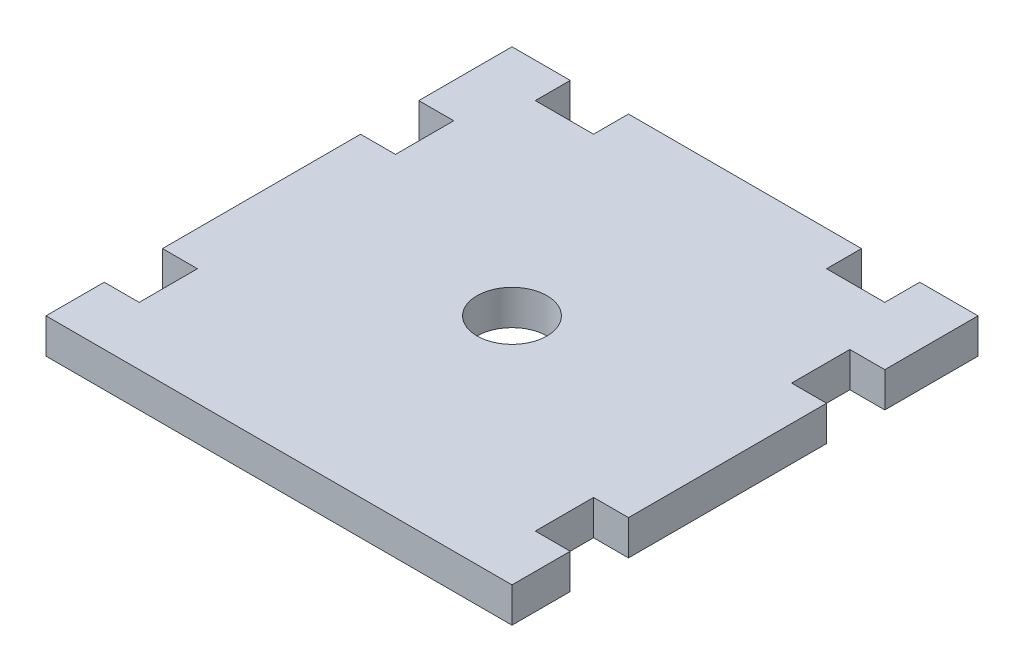
ISO-10303-21;
HEADER;
FILE_DESCRIPTION(('STEP AP214'),'2;1');
FILE_NAME('part.step','',(''),(''),'','','');
FILE_SCHEMA(('AUTOMOTIVE_DESIGN { 1 0 10303 214 1 1 1 1 }'));
ENDSEC;
DATA;
#1=APPLICATION_CONTEXT('core data for automotive mechanical design processes');
#2=APPLICATION_PROTOCOL_DEFINITION('international standard','automotive_design',2000,#1);
#3=PRODUCT_CONTEXT('',#1,'mechanical');
#4=PRODUCT('Part','Part','',(#3));
#5=PRODUCT_RELATED_PRODUCT_CATEGORY('part','',(#4));
#6=PRODUCT_DEFINITION_FORMATION('','',#4);
#7=PRODUCT_DEFINITION_CONTEXT('part definition',#1,'design');
#8=PRODUCT_DEFINITION('design','',#6,#7);
#9=PRODUCT_DEFINITION_SHAPE('','',#8);
#10=(LENGTH_UNIT() NAMED_UNIT(*) SI_UNIT(.MILLI.,.METRE.));
#11=(NAMED_UNIT(*) PLANE_ANGLE_UNIT() SI_UNIT($,.RADIAN.));
#12=(NAMED_UNIT(*) SI_UNIT($,.STERADIAN.) SOLID_ANGLE_UNIT());
#13=UNCERTAINTY_MEASURE_WITH_UNIT(LENGTH_MEASURE(1.E-05),#10,'distance_accuracy_value','');
#14=(GEOMETRIC_REPRESENTATION_CONTEXT(3) GLOBAL_UNCERTAINTY_ASSIGNED_CONTEXT((#13)) GLOBAL_UNIT_ASSIGNED_CONTEXT((#10,
#11,#12)) REPRESENTATION_CONTEXT('',''));
#15=CARTESIAN_POINT('',(0.,0.,0.));
#16=DIRECTION('',(0.,0.,1.));
#17=DIRECTION('',(1.,0.,0.));
#18=AXIS2_PLACEMENT_3D('',#15,#16,#17);
#19=CARTESIAN_POINT('',(20.,3.,20.));
#20=DIRECTION('',(-1.,0.,0.));
#21=DIRECTION('',(0.,0.,1.));
#22=AXIS2_PLACEMENT_3D('',#19,#20,#21);
#23=PLANE('',#22);
#24=DIRECTION('',(0.,0.,-1.));
#25=VECTOR('',#24,1.);
#26=CARTESIAN_POINT('',(20.,0.,20.));
#27=LINE('',#26,#25);
#28=CARTESIAN_POINT('',(20.,0.,10.));
#29=VERTEX_POINT('',#28);
#30=CARTESIAN_POINT('',(20.,0.,-7.));
#31=VERTEX_POINT('',#30);
#32=EDGE_CURVE('E422',#29,#31,#27,.T.);
#33=ORIENTED_EDGE('',*,*,#32,.T.);
#34=DIRECTION('',(0.,-1.,0.));
#35=VECTOR('',#34,1.);
#36=CARTESIAN_POINT('',(20.,3.,-7.));
#37=LINE('',#36,#35);
#38=CARTESIAN_POINT('',(20.,3.,-7.));
#39=VERTEX_POINT('',#38);
#40=EDGE_CURVE('E266',#39,#31,#37,.T.);
#41=ORIENTED_EDGE('',*,*,#40,.F.);
#42=DIRECTION('',(0.,0.,-1.));
#43=VECTOR('',#42,1.);
#44=CARTESIAN_POINT('',(20.,3.,20.));
#45=LINE('',#44,#43);
#46=CARTESIAN_POINT('',(20.,3.,10.));
#47=VERTEX_POINT('',#46);
#48=EDGE_CURVE('E404',#47,#39,#45,.T.);
#49=ORIENTED_EDGE('',*,*,#48,.F.);
#50=DIRECTION('',(0.,-1.,0.));
#51=VECTOR('',#50,1.);
#52=CARTESIAN_POINT('',(20.,3.,10.));
#53=LINE('',#52,#51);
#54=EDGE_CURVE('E337',#47,#29,#53,.T.);
#55=ORIENTED_EDGE('',*,*,#54,.T.);
#56=EDGE_LOOP('',(#33,#41,#49,#55));
#57=FACE_BOUND('',#56,.T.);
#58=ADVANCED_FACE('F44',(#57),#23,.F.);
#59=CARTESIAN_POINT('',(20.,0.,20.));
#60=VERTEX_POINT('',#59);
#61=CARTESIAN_POINT('',(20.,0.,15.));
#62=VERTEX_POINT('',#61);
#63=EDGE_CURVE('E418',#60,#62,#27,.T.);
#64=ORIENTED_EDGE('',*,*,#63,.T.);
#65=DIRECTION('',(0.,-1.,0.));
#66=VECTOR('',#65,1.);
#67=CARTESIAN_POINT('',(20.,3.,15.));
#68=LINE('',#67,#66);
#69=CARTESIAN_POINT('',(20.,3.,15.));
#70=VERTEX_POINT('',#69);
#71=EDGE_CURVE('E335',#70,#62,#68,.T.);
#72=ORIENTED_EDGE('',*,*,#71,.F.);
#73=CARTESIAN_POINT('',(20.,3.,20.));
#74=VERTEX_POINT('',#73);
#75=EDGE_CURVE('E400',#74,#70,#45,.T.);
#76=ORIENTED_EDGE('',*,*,#75,.F.);
#77=DIRECTION('',(0.,-1.,0.));
#78=VECTOR('',#77,1.);
#79=CARTESIAN_POINT('',(20.,3.,20.));
#80=LINE('',#79,#78);
#81=EDGE_CURVE('E417',#74,#60,#80,.T.);
#82=ORIENTED_EDGE('',*,*,#81,.T.);
#83=EDGE_LOOP('',(#64,#72,#76,#82));
#84=FACE_BOUND('',#83,.T.);
#85=ADVANCED_FACE('F485',(#84),#23,.F.);
#86=CARTESIAN_POINT('',(-20.,3.,20.));
#87=DIRECTION('',(1.,0.,0.));
#88=DIRECTION('',(0.,0.,-1.));
#89=AXIS2_PLACEMENT_3D('',#86,#87,#88);
#90=PLANE('',#89);
#91=DIRECTION('',(0.,0.,1.));
#92=VECTOR('',#91,1.);
#93=CARTESIAN_POINT('',(-20.,0.,20.));
#94=LINE('',#93,#92);
#95=CARTESIAN_POINT('',(-20.,0.,-7.));
#96=VERTEX_POINT('',#95);
#97=CARTESIAN_POINT('',(-20.,0.,10.));
#98=VERTEX_POINT('',#97);
#99=EDGE_CURVE('E432',#96,#98,#94,.T.);
#100=ORIENTED_EDGE('',*,*,#99,.T.);
#101=DIRECTION('',(0.,-1.,0.));
#102=VECTOR('',#101,1.);
#103=CARTESIAN_POINT('',(-20.,3.,10.));
#104=LINE('',#103,#102);
#105=CARTESIAN_POINT('',(-20.,3.,10.));
#106=VERTEX_POINT('',#105);
#107=EDGE_CURVE('E310',#106,#98,#104,.T.);
#108=ORIENTED_EDGE('',*,*,#107,.F.);
#109=DIRECTION('',(0.,0.,1.));
#110=VECTOR('',#109,1.);
#111=CARTESIAN_POINT('',(-20.,3.,20.));
#112=LINE('',#111,#110);
#113=CARTESIAN_POINT('',(-20.,3.,-7.));
#114=VERTEX_POINT('',#113);
#115=EDGE_CURVE('E415',#114,#106,#112,.T.);
#116=ORIENTED_EDGE('',*,*,#115,.F.);
#117=DIRECTION('',(0.,-1.,0.));
#118=VECTOR('',#117,1.);
#119=CARTESIAN_POINT('',(-20.,3.,-7.));
#120=LINE('',#119,#118);
#121=EDGE_CURVE('E289',#114,#96,#120,.T.);
#122=ORIENTED_EDGE('',*,*,#121,.T.);
#123=EDGE_LOOP('',(#100,#108,#116,#122));
#124=FACE_BOUND('',#123,.T.);
#125=ADVANCED_FACE('F495',(#124),#90,.F.);
#126=CARTESIAN_POINT('',(-20.,0.,-20.));
#127=VERTEX_POINT('',#126);
#128=CARTESIAN_POINT('',(-20.,0.,-12.));
#129=VERTEX_POINT('',#128);
#130=EDGE_CURVE('E428',#127,#129,#94,.T.);
#131=ORIENTED_EDGE('',*,*,#130,.T.);
#132=DIRECTION('',(0.,-1.,0.));
#133=VECTOR('',#132,1.);
#134=CARTESIAN_POINT('',(-20.,3.,-12.));
#135=LINE('',#134,#133);
#136=CARTESIAN_POINT('',(-20.,3.,-12.));
#137=VERTEX_POINT('',#136);
#138=EDGE_CURVE('E287',#137,#129,#135,.T.);
#139=ORIENTED_EDGE('',*,*,#138,.F.);
#140=CARTESIAN_POINT('',(-20.,3.,-20.));
#141=VERTEX_POINT('',#140);
#142=EDGE_CURVE('E411',#141,#137,#112,.T.);
#143=ORIENTED_EDGE('',*,*,#142,.F.);
#144=DIRECTION('',(0.,-1.,0.));
#145=VECTOR('',#144,1.);
#146=CARTESIAN_POINT('',(-20.,3.,-20.));
#147=LINE('',#146,#145);
#148=EDGE_CURVE('E52',#141,#127,#147,.T.);
#149=ORIENTED_EDGE('',*,*,#148,.T.);
#150=EDGE_LOOP('',(#131,#139,#143,#149));
#151=FACE_BOUND('',#150,.T.);
#152=ADVANCED_FACE('F443',(#151),#90,.F.);
#153=CARTESIAN_POINT('',(-20.,3.,-20.));
#154=DIRECTION('',(0.,0.,1.));
#155=DIRECTION('',(1.,0.,0.));
#156=AXIS2_PLACEMENT_3D('',#153,#154,#155);
#157=PLANE('',#156);
#158=DIRECTION('',(-1.,0.,0.));
#159=VECTOR('',#158,1.);
#160=CARTESIAN_POINT('',(-20.,0.,-20.));
#161=LINE('',#160,#159);
#162=CARTESIAN_POINT('',(20.,0.,-20.));
#163=VERTEX_POINT('',#162);
#164=CARTESIAN_POINT('',(15.,0.,-20.));
#165=VERTEX_POINT('',#164);
#166=EDGE_CURVE('E423',#163,#165,#161,.T.);
#167=ORIENTED_EDGE('',*,*,#166,.T.);
#168=DIRECTION('',(0.,-1.,0.));
#169=VECTOR('',#168,1.);
#170=CARTESIAN_POINT('',(15.,10.,-20.));
#171=LINE('',#170,#169);
#172=CARTESIAN_POINT('',(15.,3.,-20.));
#173=VERTEX_POINT('',#172);
#174=EDGE_CURVE('E351',#173,#165,#171,.T.);
#175=ORIENTED_EDGE('',*,*,#174,.F.);
#176=DIRECTION('',(-1.,0.,0.));
#177=VECTOR('',#176,1.);
#178=CARTESIAN_POINT('',(-20.,3.,-20.));
#179=LINE('',#178,#177);
#180=CARTESIAN_POINT('',(20.,3.,-20.));
#181=VERTEX_POINT('',#180);
#182=EDGE_CURVE('E406',#181,#173,#179,.T.);
#183=ORIENTED_EDGE('',*,*,#182,.F.);
#184=DIRECTION('',(0.,-1.,0.));
#185=VECTOR('',#184,1.);
#186=CARTESIAN_POINT('',(20.,3.,-20.));
#187=LINE('',#186,#185);
#188=EDGE_CURVE('E13',#181,#163,#187,.T.);
#189=ORIENTED_EDGE('',*,*,#188,.T.);
#190=EDGE_LOOP('',(#167,#175,#183,#189));
#191=FACE_BOUND('',#190,.T.);
#192=ADVANCED_FACE('F478',(#191),#157,.F.);
#193=CARTESIAN_POINT('',(-15.,3.,-20.));
#194=VERTEX_POINT('',#193);
#195=EDGE_CURVE('E403',#194,#141,#179,.T.);
#196=ORIENTED_EDGE('',*,*,#195,.F.);
#197=DIRECTION('',(0.,-1.,0.));
#198=VECTOR('',#197,1.);
#199=CARTESIAN_POINT('',(-15.,10.,-20.));
#200=LINE('',#199,#198);
#201=CARTESIAN_POINT('',(-15.,0.,-20.));
#202=VERTEX_POINT('',#201);
#203=EDGE_CURVE('E368',#194,#202,#200,.T.);
#204=ORIENTED_EDGE('',*,*,#203,.T.);
#205=EDGE_CURVE('E421',#202,#127,#161,.T.);
#206=ORIENTED_EDGE('',*,*,#205,.T.);
#207=ORIENTED_EDGE('',*,*,#148,.F.);
#208=EDGE_LOOP('',(#196,#204,#206,#207));
#209=FACE_BOUND('',#208,.T.);
#210=ADVANCED_FACE('F476',(#209),#157,.F.);
#211=CARTESIAN_POINT('',(20.,3.,-12.));
#212=VERTEX_POINT('',#211);
#213=EDGE_CURVE('E405',#212,#181,#45,.T.);
#214=ORIENTED_EDGE('',*,*,#213,.F.);
#215=DIRECTION('',(0.,-1.,0.));
#216=VECTOR('',#215,1.);
#217=CARTESIAN_POINT('',(20.,3.,-12.));
#218=LINE('',#217,#216);
#219=CARTESIAN_POINT('',(20.,0.,-12.));
#220=VERTEX_POINT('',#219);
#221=EDGE_CURVE('E239',#212,#220,#218,.T.);
#222=ORIENTED_EDGE('',*,*,#221,.T.);
#223=EDGE_CURVE('E397',#220,#163,#27,.T.);
#224=ORIENTED_EDGE('',*,*,#223,.T.);
#225=ORIENTED_EDGE('',*,*,#188,.F.);
#226=EDGE_LOOP('',(#214,#222,#224,#225));
#227=FACE_BOUND('',#226,.T.);
#228=ADVANCED_FACE('F46',(#227),#23,.F.);
#229=CARTESIAN_POINT('',(10.,3.,-20.));
#230=VERTEX_POINT('',#229);
#231=CARTESIAN_POINT('',(-10.,3.,-20.));
#232=VERTEX_POINT('',#231);
#233=EDGE_CURVE('E410',#230,#232,#179,.T.);
#234=ORIENTED_EDGE('',*,*,#233,.F.);
#235=DIRECTION('',(0.,-1.,0.));
#236=VECTOR('',#235,1.);
#237=CARTESIAN_POINT('',(10.,10.,-20.));
#238=LINE('',#237,#236);
#239=CARTESIAN_POINT('',(10.,0.,-20.));
#240=VERTEX_POINT('',#239);
#241=EDGE_CURVE('E354',#230,#240,#238,.T.);
#242=ORIENTED_EDGE('',*,*,#241,.T.);
#243=CARTESIAN_POINT('',(-10.,0.,-20.));
#244=VERTEX_POINT('',#243);
#245=EDGE_CURVE('E427',#240,#244,#161,.T.);
#246=ORIENTED_EDGE('',*,*,#245,.T.);
#247=DIRECTION('',(0.,-1.,0.));
#248=VECTOR('',#247,1.);
#249=CARTESIAN_POINT('',(-10.,10.,-20.));
#250=LINE('',#249,#248);
#251=EDGE_CURVE('E372',#232,#244,#250,.T.);
#252=ORIENTED_EDGE('',*,*,#251,.F.);
#253=EDGE_LOOP('',(#234,#242,#246,#252));
#254=FACE_BOUND('',#253,.T.);
#255=ADVANCED_FACE('F462',(#254),#157,.F.);
#256=CARTESIAN_POINT('',(-20.,3.,15.));
#257=VERTEX_POINT('',#256);
#258=CARTESIAN_POINT('',(-20.,3.,20.));
#259=VERTEX_POINT('',#258);
#260=EDGE_CURVE('E409',#257,#259,#112,.T.);
#261=ORIENTED_EDGE('',*,*,#260,.F.);
#262=DIRECTION('',(0.,-1.,0.));
#263=VECTOR('',#262,1.);
#264=CARTESIAN_POINT('',(-20.,3.,15.));
#265=LINE('',#264,#263);
#266=CARTESIAN_POINT('',(-20.,0.,15.));
#267=VERTEX_POINT('',#266);
#268=EDGE_CURVE('E312',#257,#267,#265,.T.);
#269=ORIENTED_EDGE('',*,*,#268,.T.);
#270=CARTESIAN_POINT('',(-20.,0.,20.));
#271=VERTEX_POINT('',#270);
#272=EDGE_CURVE('E426',#267,#271,#94,.T.);
#273=ORIENTED_EDGE('',*,*,#272,.T.);
#274=DIRECTION('',(0.,-1.,0.));
#275=VECTOR('',#274,1.);
#276=CARTESIAN_POINT('',(-20.,3.,20.));
#277=LINE('',#276,#275);
#278=EDGE_CURVE('E436',#259,#271,#277,.T.);
#279=ORIENTED_EDGE('',*,*,#278,.F.);
#280=EDGE_LOOP('',(#261,#269,#273,#279));
#281=FACE_BOUND('',#280,.T.);
#282=ADVANCED_FACE('F488',(#281),#90,.F.);
#283=CARTESIAN_POINT('',(-20.,3.,20.));
#284=DIRECTION('',(0.,0.,-1.));
#285=DIRECTION('',(-1.,0.,0.));
#286=AXIS2_PLACEMENT_3D('',#283,#284,#285);
#287=PLANE('',#286);
#288=DIRECTION('',(1.,0.,0.));
#289=VECTOR('',#288,1.);
#290=CARTESIAN_POINT('',(-20.,0.,20.));
#291=LINE('',#290,#289);
#292=EDGE_CURVE('E431',#271,#60,#291,.T.);
#293=ORIENTED_EDGE('',*,*,#292,.T.);
#294=ORIENTED_EDGE('',*,*,#81,.F.);
#295=DIRECTION('',(1.,0.,0.));
#296=VECTOR('',#295,1.);
#297=CARTESIAN_POINT('',(-20.,3.,20.));
#298=LINE('',#297,#296);
#299=EDGE_CURVE('E414',#259,#74,#298,.T.);
#300=ORIENTED_EDGE('',*,*,#299,.F.);
#301=ORIENTED_EDGE('',*,*,#278,.T.);
#302=EDGE_LOOP('',(#293,#294,#300,#301));
#303=FACE_BOUND('',#302,.T.);
#304=ADVANCED_FACE('F528',(#303),#287,.F.);
#305=CARTESIAN_POINT('',(0.,3.,0.));
#306=DIRECTION('',(0.,-1.,0.));
#307=DIRECTION('',(0.,0.,-1.));
#308=AXIS2_PLACEMENT_3D('',#305,#306,#307);
#309=PLANE('',#308);
#310=ORIENTED_EDGE('',*,*,#115,.T.);
#311=DIRECTION('',(1.,0.,0.));
#312=VECTOR('',#311,1.);
#313=CARTESIAN_POINT('',(-17.,3.,10.));
#314=LINE('',#313,#312);
#315=CARTESIAN_POINT('',(-17.,3.,10.));
#316=VERTEX_POINT('',#315);
#317=EDGE_CURVE('E300',#106,#316,#314,.T.);
#318=ORIENTED_EDGE('',*,*,#317,.T.);
#319=DIRECTION('',(0.,0.,1.));
#320=VECTOR('',#319,1.);
#321=CARTESIAN_POINT('',(-17.,3.,15.));
#322=LINE('',#321,#320);
#323=CARTESIAN_POINT('',(-17.,3.,15.));
#324=VERTEX_POINT('',#323);
#325=EDGE_CURVE('E293',#316,#324,#322,.T.);
#326=ORIENTED_EDGE('',*,*,#325,.T.);
#327=DIRECTION('',(-1.,0.,0.));
#328=VECTOR('',#327,1.);
#329=CARTESIAN_POINT('',(-17.,3.,15.));
#330=LINE('',#329,#328);
#331=EDGE_CURVE('E296',#324,#257,#330,.T.);
#332=ORIENTED_EDGE('',*,*,#331,.T.);
#333=ORIENTED_EDGE('',*,*,#260,.T.);
#334=ORIENTED_EDGE('',*,*,#299,.T.);
#335=ORIENTED_EDGE('',*,*,#75,.T.);
#336=DIRECTION('',(-1.,0.,0.));
#337=VECTOR('',#336,1.);
#338=CARTESIAN_POINT('',(17.,3.,15.));
#339=LINE('',#338,#337);
#340=CARTESIAN_POINT('',(17.,3.,15.));
#341=VERTEX_POINT('',#340);
#342=EDGE_CURVE('E323',#70,#341,#339,.T.);
#343=ORIENTED_EDGE('',*,*,#342,.T.);
#344=DIRECTION('',(0.,0.,-1.));
#345=VECTOR('',#344,1.);
#346=CARTESIAN_POINT('',(17.,3.,15.));
#347=LINE('',#346,#345);
#348=CARTESIAN_POINT('',(17.,3.,10.));
#349=VERTEX_POINT('',#348);
#350=EDGE_CURVE('E316',#341,#349,#347,.T.);
#351=ORIENTED_EDGE('',*,*,#350,.T.);
#352=DIRECTION('',(1.,0.,0.));
#353=VECTOR('',#352,1.);
#354=CARTESIAN_POINT('',(17.,3.,10.));
#355=LINE('',#354,#353);
#356=EDGE_CURVE('E319',#349,#47,#355,.T.);
#357=ORIENTED_EDGE('',*,*,#356,.T.);
#358=ORIENTED_EDGE('',*,*,#48,.T.);
#359=DIRECTION('',(-1.,0.,0.));
#360=VECTOR('',#359,1.);
#361=CARTESIAN_POINT('',(17.,3.,-7.));
#362=LINE('',#361,#360);
#363=CARTESIAN_POINT('',(17.,3.,-7.));
#364=VERTEX_POINT('',#363);
#365=EDGE_CURVE('E240',#39,#364,#362,.T.);
#366=ORIENTED_EDGE('',*,*,#365,.T.);
#367=DIRECTION('',(0.,0.,-1.));
#368=VECTOR('',#367,1.);
#369=CARTESIAN_POINT('',(17.,3.,-7.));
#370=LINE('',#369,#368);
#371=CARTESIAN_POINT('',(17.,3.,-12.));
#372=VERTEX_POINT('',#371);
#373=EDGE_CURVE('E233',#364,#372,#370,.T.);
#374=ORIENTED_EDGE('',*,*,#373,.T.);
#375=DIRECTION('',(1.,0.,0.));
#376=VECTOR('',#375,1.);
#377=CARTESIAN_POINT('',(17.,3.,-12.));
#378=LINE('',#377,#376);
#379=EDGE_CURVE('E243',#372,#212,#378,.T.);
#380=ORIENTED_EDGE('',*,*,#379,.T.);
#381=ORIENTED_EDGE('',*,*,#213,.T.);
#382=ORIENTED_EDGE('',*,*,#182,.T.);
#383=DIRECTION('',(0.,0.,1.));
#384=VECTOR('',#383,1.);
#385=CARTESIAN_POINT('',(15.,3.,0.));
#386=LINE('',#385,#384);
#387=CARTESIAN_POINT('',(15.,3.,-17.));
#388=VERTEX_POINT('',#387);
#389=EDGE_CURVE('E390',#173,#388,#386,.T.);
#390=ORIENTED_EDGE('',*,*,#389,.T.);
#391=DIRECTION('',(-1.,0.,0.));
#392=VECTOR('',#391,1.);
#393=CARTESIAN_POINT('',(0.,3.,-17.));
#394=LINE('',#393,#392);
#395=CARTESIAN_POINT('',(10.,3.,-17.));
#396=VERTEX_POINT('',#395);
#397=EDGE_CURVE('E384',#388,#396,#394,.T.);
#398=ORIENTED_EDGE('',*,*,#397,.T.);
#399=DIRECTION('',(0.,0.,-1.));
#400=VECTOR('',#399,1.);
#401=CARTESIAN_POINT('',(10.,3.,0.));
#402=LINE('',#401,#400);
#403=EDGE_CURVE('E387',#396,#230,#402,.T.);
#404=ORIENTED_EDGE('',*,*,#403,.T.);
#405=ORIENTED_EDGE('',*,*,#233,.T.);
#406=DIRECTION('',(0.,0.,1.));
#407=VECTOR('',#406,1.);
#408=CARTESIAN_POINT('',(-10.,3.,0.));
#409=LINE('',#408,#407);
#410=CARTESIAN_POINT('',(-10.,3.,-17.));
#411=VERTEX_POINT('',#410);
#412=EDGE_CURVE('E353',#232,#411,#409,.T.);
#413=ORIENTED_EDGE('',*,*,#412,.T.);
#414=DIRECTION('',(-1.,0.,0.));
#415=VECTOR('',#414,1.);
#416=CARTESIAN_POINT('',(0.,3.,-17.));
#417=LINE('',#416,#415);
#418=CARTESIAN_POINT('',(-15.,3.,-17.));
#419=VERTEX_POINT('',#418);
#420=EDGE_CURVE('E378',#411,#419,#417,.T.);
#421=ORIENTED_EDGE('',*,*,#420,.T.);
#422=DIRECTION('',(0.,0.,-1.));
#423=VECTOR('',#422,1.);
#424=CARTESIAN_POINT('',(-15.,3.,0.));
#425=LINE('',#424,#423);
#426=EDGE_CURVE('E381',#419,#194,#425,.T.);
#427=ORIENTED_EDGE('',*,*,#426,.T.);
#428=ORIENTED_EDGE('',*,*,#195,.T.);
#429=ORIENTED_EDGE('',*,*,#142,.T.);
#430=DIRECTION('',(1.,0.,0.));
#431=VECTOR('',#430,1.);
#432=CARTESIAN_POINT('',(-17.,3.,-12.));
#433=LINE('',#432,#431);
#434=CARTESIAN_POINT('',(-17.,3.,-12.));
#435=VERTEX_POINT('',#434);
#436=EDGE_CURVE('E276',#137,#435,#433,.T.);
#437=ORIENTED_EDGE('',*,*,#436,.T.);
#438=DIRECTION('',(0.,0.,1.));
#439=VECTOR('',#438,1.);
#440=CARTESIAN_POINT('',(-17.,3.,-7.));
#441=LINE('',#440,#439);
#442=CARTESIAN_POINT('',(-17.,3.,-7.));
#443=VERTEX_POINT('',#442);
#444=EDGE_CURVE('E269',#435,#443,#441,.T.);
#445=ORIENTED_EDGE('',*,*,#444,.T.);
#446=DIRECTION('',(-1.,0.,0.));
#447=VECTOR('',#446,1.);
#448=CARTESIAN_POINT('',(-17.,3.,-7.));
#449=LINE('',#448,#447);
#450=EDGE_CURVE('E272',#443,#114,#449,.T.);
#451=ORIENTED_EDGE('',*,*,#450,.T.);
#452=EDGE_LOOP('',(#310,#318,#326,#332,#333,#334,#335,#343,#351,#357,#358,#366,#374,#380,#381,
#382,#390,#398,#404,#405,#413,#421,#427,#428,#429,#437,#445,#451));
#453=FACE_BOUND('',#452,.T.);
#454=CARTESIAN_POINT('',(0.,3.,0.));
#455=DIRECTION('',(0.,1.,0.));
#456=DIRECTION('',(0.,0.,1.));
#457=AXIS2_PLACEMENT_3D('',#454,#455,#456);
#458=CIRCLE('',#457,3.);
#459=CARTESIAN_POINT('',(0.,3.,3.));
#460=VERTEX_POINT('',#459);
#461=EDGE_CURVE('E393',#460,#460,#458,.T.);
#462=ORIENTED_EDGE('',*,*,#461,.F.);
#463=EDGE_LOOP('',(#462));
#464=FACE_BOUND('',#463,.T.);
#465=ADVANCED_FACE('F250',(#453,#464),#309,.F.);
#466=CARTESIAN_POINT('',(0.,0.,0.));
#467=DIRECTION('',(0.,-1.,0.));
#468=DIRECTION('',(0.,0.,-1.));
#469=AXIS2_PLACEMENT_3D('',#466,#467,#468);
#470=PLANE('',#469);
#471=DIRECTION('',(1.,0.,0.));
#472=VECTOR('',#471,1.);
#473=CARTESIAN_POINT('',(-17.,0.,10.));
#474=LINE('',#473,#472);
#475=CARTESIAN_POINT('',(-17.,0.,10.));
#476=VERTEX_POINT('',#475);
#477=EDGE_CURVE('E297',#98,#476,#474,.T.);
#478=ORIENTED_EDGE('',*,*,#477,.F.);
#479=ORIENTED_EDGE('',*,*,#99,.F.);
#480=DIRECTION('',(-1.,0.,0.));
#481=VECTOR('',#480,1.);
#482=CARTESIAN_POINT('',(-17.,0.,-7.));
#483=LINE('',#482,#481);
#484=CARTESIAN_POINT('',(-17.,0.,-7.));
#485=VERTEX_POINT('',#484);
#486=EDGE_CURVE('E281',#485,#96,#483,.T.);
#487=ORIENTED_EDGE('',*,*,#486,.F.);
#488=DIRECTION('',(0.,0.,1.));
#489=VECTOR('',#488,1.);
#490=CARTESIAN_POINT('',(-17.,0.,-7.));
#491=LINE('',#490,#489);
#492=CARTESIAN_POINT('',(-17.,0.,-12.));
#493=VERTEX_POINT('',#492);
#494=EDGE_CURVE('E67',#493,#485,#491,.T.);
#495=ORIENTED_EDGE('',*,*,#494,.F.);
#496=DIRECTION('',(1.,0.,0.));
#497=VECTOR('',#496,1.);
#498=CARTESIAN_POINT('',(-17.,0.,-12.));
#499=LINE('',#498,#497);
#500=EDGE_CURVE('E273',#129,#493,#499,.T.);
#501=ORIENTED_EDGE('',*,*,#500,.F.);
#502=ORIENTED_EDGE('',*,*,#130,.F.);
#503=ORIENTED_EDGE('',*,*,#205,.F.);
#504=DIRECTION('',(0.,0.,-1.));
#505=VECTOR('',#504,1.);
#506=CARTESIAN_POINT('',(-15.,0.,-20.));
#507=LINE('',#506,#505);
#508=CARTESIAN_POINT('',(-15.,0.,-17.));
#509=VERTEX_POINT('',#508);
#510=EDGE_CURVE('E334',#509,#202,#507,.T.);
#511=ORIENTED_EDGE('',*,*,#510,.F.);
#512=DIRECTION('',(-1.,0.,0.));
#513=VECTOR('',#512,1.);
#514=CARTESIAN_POINT('',(-15.,0.,-17.));
#515=LINE('',#514,#513);
#516=CARTESIAN_POINT('',(-10.,0.,-17.));
#517=VERTEX_POINT('',#516);
#518=EDGE_CURVE('E365',#517,#509,#515,.T.);
#519=ORIENTED_EDGE('',*,*,#518,.F.);
#520=DIRECTION('',(0.,0.,1.));
#521=VECTOR('',#520,1.);
#522=CARTESIAN_POINT('',(-10.,0.,-20.));
#523=LINE('',#522,#521);
#524=EDGE_CURVE('E362',#244,#517,#523,.T.);
#525=ORIENTED_EDGE('',*,*,#524,.F.);
#526=ORIENTED_EDGE('',*,*,#245,.F.);
#527=DIRECTION('',(0.,0.,-1.));
#528=VECTOR('',#527,1.);
#529=CARTESIAN_POINT('',(10.,0.,-20.));
#530=LINE('',#529,#528);
#531=CARTESIAN_POINT('',(10.,0.,-17.));
#532=VERTEX_POINT('',#531);
#533=EDGE_CURVE('E348',#532,#240,#530,.T.);
#534=ORIENTED_EDGE('',*,*,#533,.F.);
#535=DIRECTION('',(-1.,0.,0.));
#536=VECTOR('',#535,1.);
#537=CARTESIAN_POINT('',(15.,0.,-17.));
#538=LINE('',#537,#536);
#539=CARTESIAN_POINT('',(15.,0.,-17.));
#540=VERTEX_POINT('',#539);
#541=EDGE_CURVE('E344',#540,#532,#538,.T.);
#542=ORIENTED_EDGE('',*,*,#541,.F.);
#543=DIRECTION('',(0.,0.,1.));
#544=VECTOR('',#543,1.);
#545=CARTESIAN_POINT('',(15.,0.,-20.));
#546=LINE('',#545,#544);
#547=EDGE_CURVE('E342',#165,#540,#546,.T.);
#548=ORIENTED_EDGE('',*,*,#547,.F.);
#549=ORIENTED_EDGE('',*,*,#166,.F.);
#550=ORIENTED_EDGE('',*,*,#223,.F.);
#551=DIRECTION('',(1.,0.,0.));
#552=VECTOR('',#551,1.);
#553=CARTESIAN_POINT('',(17.,0.,-12.));
#554=LINE('',#553,#552);
#555=CARTESIAN_POINT('',(17.,0.,-12.));
#556=VERTEX_POINT('',#555);
#557=EDGE_CURVE('E256',#556,#220,#554,.T.);
#558=ORIENTED_EDGE('',*,*,#557,.F.);
#559=DIRECTION('',(0.,0.,-1.));
#560=VECTOR('',#559,1.);
#561=CARTESIAN_POINT('',(17.,0.,-7.));
#562=LINE('',#561,#560);
#563=CARTESIAN_POINT('',(17.,0.,-7.));
#564=VERTEX_POINT('',#563);
#565=EDGE_CURVE('E236',#564,#556,#562,.T.);
#566=ORIENTED_EDGE('',*,*,#565,.F.);
#567=DIRECTION('',(-1.,0.,0.));
#568=VECTOR('',#567,1.);
#569=CARTESIAN_POINT('',(17.,0.,-7.));
#570=LINE('',#569,#568);
#571=EDGE_CURVE('E253',#31,#564,#570,.T.);
#572=ORIENTED_EDGE('',*,*,#571,.F.);
#573=ORIENTED_EDGE('',*,*,#32,.F.);
#574=DIRECTION('',(1.,0.,0.));
#575=VECTOR('',#574,1.);
#576=CARTESIAN_POINT('',(17.,0.,10.));
#577=LINE('',#576,#575);
#578=CARTESIAN_POINT('',(17.,0.,10.));
#579=VERTEX_POINT('',#578);
#580=EDGE_CURVE('E328',#579,#29,#577,.T.);
#581=ORIENTED_EDGE('',*,*,#580,.F.);
#582=DIRECTION('',(0.,0.,-1.));
#583=VECTOR('',#582,1.);
#584=CARTESIAN_POINT('',(17.,0.,15.));
#585=LINE('',#584,#583);
#586=CARTESIAN_POINT('',(17.,0.,15.));
#587=VERTEX_POINT('',#586);
#588=EDGE_CURVE('E265',#587,#579,#585,.T.);
#589=ORIENTED_EDGE('',*,*,#588,.F.);
#590=DIRECTION('',(-1.,0.,0.));
#591=VECTOR('',#590,1.);
#592=CARTESIAN_POINT('',(17.,0.,15.));
#593=LINE('',#592,#591);
#594=EDGE_CURVE('E320',#62,#587,#593,.T.);
#595=ORIENTED_EDGE('',*,*,#594,.F.);
#596=ORIENTED_EDGE('',*,*,#63,.F.);
#597=ORIENTED_EDGE('',*,*,#292,.F.);
#598=ORIENTED_EDGE('',*,*,#272,.F.);
#599=DIRECTION('',(-1.,0.,0.));
#600=VECTOR('',#599,1.);
#601=CARTESIAN_POINT('',(-17.,0.,15.));
#602=LINE('',#601,#600);
#603=CARTESIAN_POINT('',(-17.,0.,15.));
#604=VERTEX_POINT('',#603);
#605=EDGE_CURVE('E305',#604,#267,#602,.T.);
#606=ORIENTED_EDGE('',*,*,#605,.F.);
#607=DIRECTION('',(0.,0.,1.));
#608=VECTOR('',#607,1.);
#609=CARTESIAN_POINT('',(-17.,0.,15.));
#610=LINE('',#609,#608);
#611=EDGE_CURVE('E59',#476,#604,#610,.T.);
#612=ORIENTED_EDGE('',*,*,#611,.F.);
#613=EDGE_LOOP('',(#478,#479,#487,#495,#501,#502,#503,#511,#519,#525,#526,#534,#542,#548,#549,
#550,#558,#566,#572,#573,#581,#589,#595,#596,#597,#598,#606,#612));
#614=FACE_BOUND('',#613,.T.);
#615=CARTESIAN_POINT('',(0.,0.,0.));
#616=DIRECTION('',(0.,1.,0.));
#617=DIRECTION('',(0.,0.,1.));
#618=AXIS2_PLACEMENT_3D('',#615,#616,#617);
#619=CIRCLE('',#618,3.);
#620=CARTESIAN_POINT('',(0.,0.,3.));
#621=VERTEX_POINT('',#620);
#622=EDGE_CURVE('E394',#621,#621,#619,.T.);
#623=ORIENTED_EDGE('',*,*,#622,.T.);
#624=EDGE_LOOP('',(#623));
#625=FACE_BOUND('',#624,.T.);
#626=ADVANCED_FACE('F451',(#614,#625),#470,.T.);
#627=CARTESIAN_POINT('',(0.,0.,0.));
#628=DIRECTION('',(0.,1.,0.));
#629=DIRECTION('',(0.,0.,1.));
#630=AXIS2_PLACEMENT_3D('',#627,#628,#629);
#631=CYLINDRICAL_SURFACE('',#630,3.);
#632=ORIENTED_EDGE('',*,*,#622,.F.);
#633=EDGE_LOOP('',(#632));
#634=FACE_BOUND('',#633,.T.);
#635=ORIENTED_EDGE('',*,*,#461,.T.);
#636=EDGE_LOOP('',(#635));
#637=FACE_BOUND('',#636,.T.);
#638=ADVANCED_FACE('F589',(#634,#637),#631,.F.);
#639=CARTESIAN_POINT('',(-15.,10.,-20.));
#640=DIRECTION('',(-1.,0.,0.));
#641=DIRECTION('',(0.,0.,1.));
#642=AXIS2_PLACEMENT_3D('',#639,#640,#641);
#643=PLANE('',#642);
#644=DIRECTION('',(0.,-1.,0.));
#645=VECTOR('',#644,1.);
#646=CARTESIAN_POINT('',(-15.,10.,-17.));
#647=LINE('',#646,#645);
#648=EDGE_CURVE('E345',#419,#509,#647,.T.);
#649=ORIENTED_EDGE('',*,*,#648,.T.);
#650=ORIENTED_EDGE('',*,*,#510,.T.);
#651=ORIENTED_EDGE('',*,*,#203,.F.);
#652=ORIENTED_EDGE('',*,*,#426,.F.);
#653=EDGE_LOOP('',(#649,#650,#651,#652));
#654=FACE_BOUND('',#653,.T.);
#655=ADVANCED_FACE('F475',(#654),#643,.F.);
#656=CARTESIAN_POINT('',(-15.,10.,-17.));
#657=DIRECTION('',(0.,0.,1.));
#658=DIRECTION('',(1.,0.,0.));
#659=AXIS2_PLACEMENT_3D('',#656,#657,#658);
#660=PLANE('',#659);
#661=DIRECTION('',(0.,-1.,0.));
#662=VECTOR('',#661,1.);
#663=CARTESIAN_POINT('',(-10.,10.,-17.));
#664=LINE('',#663,#662);
#665=EDGE_CURVE('E370',#411,#517,#664,.T.);
#666=ORIENTED_EDGE('',*,*,#665,.T.);
#667=ORIENTED_EDGE('',*,*,#518,.T.);
#668=ORIENTED_EDGE('',*,*,#648,.F.);
#669=ORIENTED_EDGE('',*,*,#420,.F.);
#670=EDGE_LOOP('',(#666,#667,#668,#669));
#671=FACE_BOUND('',#670,.T.);
#672=ADVANCED_FACE('F473',(#671),#660,.F.);
#673=CARTESIAN_POINT('',(-10.,10.,-20.));
#674=DIRECTION('',(1.,0.,0.));
#675=DIRECTION('',(0.,0.,-1.));
#676=AXIS2_PLACEMENT_3D('',#673,#674,#675);
#677=PLANE('',#676);
#678=ORIENTED_EDGE('',*,*,#251,.T.);
#679=ORIENTED_EDGE('',*,*,#524,.T.);
#680=ORIENTED_EDGE('',*,*,#665,.F.);
#681=ORIENTED_EDGE('',*,*,#412,.F.);
#682=EDGE_LOOP('',(#678,#679,#680,#681));
#683=FACE_BOUND('',#682,.T.);
#684=ADVANCED_FACE('F467',(#683),#677,.F.);
#685=CARTESIAN_POINT('',(15.,10.,-20.));
#686=DIRECTION('',(1.,0.,0.));
#687=DIRECTION('',(0.,0.,-1.));
#688=AXIS2_PLACEMENT_3D('',#685,#686,#687);
#689=PLANE('',#688);
#690=ORIENTED_EDGE('',*,*,#174,.T.);
#691=ORIENTED_EDGE('',*,*,#547,.T.);
#692=DIRECTION('',(0.,-1.,0.));
#693=VECTOR('',#692,1.);
#694=CARTESIAN_POINT('',(15.,10.,-17.));
#695=LINE('',#694,#693);
#696=EDGE_CURVE('E350',#388,#540,#695,.T.);
#697=ORIENTED_EDGE('',*,*,#696,.F.);
#698=ORIENTED_EDGE('',*,*,#389,.F.);
#699=EDGE_LOOP('',(#690,#691,#697,#698));
#700=FACE_BOUND('',#699,.T.);
#701=ADVANCED_FACE('F575',(#700),#689,.F.);
#702=CARTESIAN_POINT('',(10.,10.,-20.));
#703=DIRECTION('',(-1.,0.,0.));
#704=DIRECTION('',(0.,0.,1.));
#705=AXIS2_PLACEMENT_3D('',#702,#703,#704);
#706=PLANE('',#705);
#707=DIRECTION('',(0.,-1.,0.));
#708=VECTOR('',#707,1.);
#709=CARTESIAN_POINT('',(10.,10.,-17.));
#710=LINE('',#709,#708);
#711=EDGE_CURVE('E357',#396,#532,#710,.T.);
#712=ORIENTED_EDGE('',*,*,#711,.T.);
#713=ORIENTED_EDGE('',*,*,#533,.T.);
#714=ORIENTED_EDGE('',*,*,#241,.F.);
#715=ORIENTED_EDGE('',*,*,#403,.F.);
#716=EDGE_LOOP('',(#712,#713,#714,#715));
#717=FACE_BOUND('',#716,.T.);
#718=ADVANCED_FACE('F572',(#717),#706,.F.);
#719=CARTESIAN_POINT('',(15.,10.,-17.));
#720=DIRECTION('',(0.,0.,1.));
#721=DIRECTION('',(1.,0.,0.));
#722=AXIS2_PLACEMENT_3D('',#719,#720,#721);
#723=PLANE('',#722);
#724=ORIENTED_EDGE('',*,*,#696,.T.);
#725=ORIENTED_EDGE('',*,*,#541,.T.);
#726=ORIENTED_EDGE('',*,*,#711,.F.);
#727=ORIENTED_EDGE('',*,*,#397,.F.);
#728=EDGE_LOOP('',(#724,#725,#726,#727));
#729=FACE_BOUND('',#728,.T.);
#730=ADVANCED_FACE('F571',(#729),#723,.F.);
#731=CARTESIAN_POINT('',(17.,3.,15.));
#732=DIRECTION('',(-1.,0.,0.));
#733=DIRECTION('',(0.,0.,1.));
#734=AXIS2_PLACEMENT_3D('',#731,#732,#733);
#735=PLANE('',#734);
#736=ORIENTED_EDGE('',*,*,#588,.T.);
#737=DIRECTION('',(0.,-1.,0.));
#738=VECTOR('',#737,1.);
#739=CARTESIAN_POINT('',(17.,3.,10.));
#740=LINE('',#739,#738);
#741=EDGE_CURVE('E326',#349,#579,#740,.T.);
#742=ORIENTED_EDGE('',*,*,#741,.F.);
#743=ORIENTED_EDGE('',*,*,#350,.F.);
#744=DIRECTION('',(0.,-1.,0.));
#745=VECTOR('',#744,1.);
#746=CARTESIAN_POINT('',(17.,3.,15.));
#747=LINE('',#746,#745);
#748=EDGE_CURVE('E332',#341,#587,#747,.T.);
#749=ORIENTED_EDGE('',*,*,#748,.T.);
#750=EDGE_LOOP('',(#736,#742,#743,#749));
#751=FACE_BOUND('',#750,.T.);
#752=ADVANCED_FACE('F518',(#751),#735,.F.);
#753=CARTESIAN_POINT('',(17.,3.,15.));
#754=DIRECTION('',(0.,0.,1.));
#755=DIRECTION('',(1.,0.,0.));
#756=AXIS2_PLACEMENT_3D('',#753,#754,#755);
#757=PLANE('',#756);
#758=ORIENTED_EDGE('',*,*,#594,.T.);
#759=ORIENTED_EDGE('',*,*,#748,.F.);
#760=ORIENTED_EDGE('',*,*,#342,.F.);
#761=ORIENTED_EDGE('',*,*,#71,.T.);
#762=EDGE_LOOP('',(#758,#759,#760,#761));
#763=FACE_BOUND('',#762,.T.);
#764=ADVANCED_FACE('F520',(#763),#757,.F.);
#765=CARTESIAN_POINT('',(17.,3.,10.));
#766=DIRECTION('',(0.,0.,-1.));
#767=DIRECTION('',(-1.,0.,0.));
#768=AXIS2_PLACEMENT_3D('',#765,#766,#767);
#769=PLANE('',#768);
#770=ORIENTED_EDGE('',*,*,#580,.T.);
#771=ORIENTED_EDGE('',*,*,#54,.F.);
#772=ORIENTED_EDGE('',*,*,#356,.F.);
#773=ORIENTED_EDGE('',*,*,#741,.T.);
#774=EDGE_LOOP('',(#770,#771,#772,#773));
#775=FACE_BOUND('',#774,.T.);
#776=ADVANCED_FACE('F513',(#775),#769,.F.);
#777=CARTESIAN_POINT('',(17.,3.,-7.));
#778=DIRECTION('',(-1.,0.,0.));
#779=DIRECTION('',(0.,0.,1.));
#780=AXIS2_PLACEMENT_3D('',#777,#778,#779);
#781=PLANE('',#780);
#782=ORIENTED_EDGE('',*,*,#565,.T.);
#783=DIRECTION('',(0.,-1.,0.));
#784=VECTOR('',#783,1.);
#785=CARTESIAN_POINT('',(17.,3.,-12.));
#786=LINE('',#785,#784);
#787=EDGE_CURVE('E229',#372,#556,#786,.T.);
#788=ORIENTED_EDGE('',*,*,#787,.F.);
#789=ORIENTED_EDGE('',*,*,#373,.F.);
#790=DIRECTION('',(0.,-1.,0.));
#791=VECTOR('',#790,1.);
#792=CARTESIAN_POINT('',(17.,3.,-7.));
#793=LINE('',#792,#791);
#794=EDGE_CURVE('E263',#364,#564,#793,.T.);
#795=ORIENTED_EDGE('',*,*,#794,.T.);
#796=EDGE_LOOP('',(#782,#788,#789,#795));
#797=FACE_BOUND('',#796,.T.);
#798=ADVANCED_FACE('F231',(#797),#781,.F.);
#799=CARTESIAN_POINT('',(17.,3.,-7.));
#800=DIRECTION('',(0.,0.,1.));
#801=DIRECTION('',(1.,0.,0.));
#802=AXIS2_PLACEMENT_3D('',#799,#800,#801);
#803=PLANE('',#802);
#804=ORIENTED_EDGE('',*,*,#571,.T.);
#805=ORIENTED_EDGE('',*,*,#794,.F.);
#806=ORIENTED_EDGE('',*,*,#365,.F.);
#807=ORIENTED_EDGE('',*,*,#40,.T.);
#808=EDGE_LOOP('',(#804,#805,#806,#807));
#809=FACE_BOUND('',#808,.T.);
#810=ADVANCED_FACE('F552',(#809),#803,.F.);
#811=CARTESIAN_POINT('',(17.,3.,-12.));
#812=DIRECTION('',(0.,0.,-1.));
#813=DIRECTION('',(-1.,0.,0.));
#814=AXIS2_PLACEMENT_3D('',#811,#812,#813);
#815=PLANE('',#814);
#816=ORIENTED_EDGE('',*,*,#557,.T.);
#817=ORIENTED_EDGE('',*,*,#221,.F.);
#818=ORIENTED_EDGE('',*,*,#379,.F.);
#819=ORIENTED_EDGE('',*,*,#787,.T.);
#820=EDGE_LOOP('',(#816,#817,#818,#819));
#821=FACE_BOUND('',#820,.T.);
#822=ADVANCED_FACE('F244',(#821),#815,.F.);
#823=CARTESIAN_POINT('',(-17.,3.,-7.));
#824=DIRECTION('',(1.,0.,0.));
#825=DIRECTION('',(0.,0.,-1.));
#826=AXIS2_PLACEMENT_3D('',#823,#824,#825);
#827=PLANE('',#826);
#828=ORIENTED_EDGE('',*,*,#494,.T.);
#829=DIRECTION('',(0.,-1.,0.));
#830=VECTOR('',#829,1.);
#831=CARTESIAN_POINT('',(-17.,3.,-7.));
#832=LINE('',#831,#830);
#833=EDGE_CURVE('E279',#443,#485,#832,.T.);
#834=ORIENTED_EDGE('',*,*,#833,.F.);
#835=ORIENTED_EDGE('',*,*,#444,.F.);
#836=DIRECTION('',(0.,-1.,0.));
#837=VECTOR('',#836,1.);
#838=CARTESIAN_POINT('',(-17.,3.,-12.));
#839=LINE('',#838,#837);
#840=EDGE_CURVE('E261',#435,#493,#839,.T.);
#841=ORIENTED_EDGE('',*,*,#840,.T.);
#842=EDGE_LOOP('',(#828,#834,#835,#841));
#843=FACE_BOUND('',#842,.T.);
#844=ADVANCED_FACE('F544',(#843),#827,.F.);
#845=CARTESIAN_POINT('',(-17.,3.,-12.));
#846=DIRECTION('',(0.,0.,-1.));
#847=DIRECTION('',(-1.,0.,0.));
#848=AXIS2_PLACEMENT_3D('',#845,#846,#847);
#849=PLANE('',#848);
#850=ORIENTED_EDGE('',*,*,#500,.T.);
#851=ORIENTED_EDGE('',*,*,#840,.F.);
#852=ORIENTED_EDGE('',*,*,#436,.F.);
#853=ORIENTED_EDGE('',*,*,#138,.T.);
#854=EDGE_LOOP('',(#850,#851,#852,#853));
#855=FACE_BOUND('',#854,.T.);
#856=ADVANCED_FACE('F456',(#855),#849,.F.);
#857=CARTESIAN_POINT('',(-17.,3.,-7.));
#858=DIRECTION('',(0.,0.,1.));
#859=DIRECTION('',(1.,0.,0.));
#860=AXIS2_PLACEMENT_3D('',#857,#858,#859);
#861=PLANE('',#860);
#862=ORIENTED_EDGE('',*,*,#486,.T.);
#863=ORIENTED_EDGE('',*,*,#121,.F.);
#864=ORIENTED_EDGE('',*,*,#450,.F.);
#865=ORIENTED_EDGE('',*,*,#833,.T.);
#866=EDGE_LOOP('',(#862,#863,#864,#865));
#867=FACE_BOUND('',#866,.T.);
#868=ADVANCED_FACE('F543',(#867),#861,.F.);
#869=CARTESIAN_POINT('',(-17.,3.,15.));
#870=DIRECTION('',(1.,0.,0.));
#871=DIRECTION('',(0.,0.,-1.));
#872=AXIS2_PLACEMENT_3D('',#869,#870,#871);
#873=PLANE('',#872);
#874=ORIENTED_EDGE('',*,*,#611,.T.);
#875=DIRECTION('',(0.,-1.,0.));
#876=VECTOR('',#875,1.);
#877=CARTESIAN_POINT('',(-17.,3.,15.));
#878=LINE('',#877,#876);
#879=EDGE_CURVE('E303',#324,#604,#878,.T.);
#880=ORIENTED_EDGE('',*,*,#879,.F.);
#881=ORIENTED_EDGE('',*,*,#325,.F.);
#882=DIRECTION('',(0.,-1.,0.));
#883=VECTOR('',#882,1.);
#884=CARTESIAN_POINT('',(-17.,3.,10.));
#885=LINE('',#884,#883);
#886=EDGE_CURVE('E282',#316,#476,#885,.T.);
#887=ORIENTED_EDGE('',*,*,#886,.T.);
#888=EDGE_LOOP('',(#874,#880,#881,#887));
#889=FACE_BOUND('',#888,.T.);
#890=ADVANCED_FACE('F559',(#889),#873,.F.);
#891=CARTESIAN_POINT('',(-17.,3.,10.));
#892=DIRECTION('',(0.,0.,-1.));
#893=DIRECTION('',(-1.,0.,0.));
#894=AXIS2_PLACEMENT_3D('',#891,#892,#893);
#895=PLANE('',#894);
#896=ORIENTED_EDGE('',*,*,#477,.T.);
#897=ORIENTED_EDGE('',*,*,#886,.F.);
#898=ORIENTED_EDGE('',*,*,#317,.F.);
#899=ORIENTED_EDGE('',*,*,#107,.T.);
#900=EDGE_LOOP('',(#896,#897,#898,#899));
#901=FACE_BOUND('',#900,.T.);
#902=ADVANCED_FACE('F539',(#901),#895,.F.);
#903=CARTESIAN_POINT('',(-17.,3.,15.));
#904=DIRECTION('',(0.,0.,1.));
#905=DIRECTION('',(1.,0.,0.));
#906=AXIS2_PLACEMENT_3D('',#903,#904,#905);
#907=PLANE('',#906);
#908=ORIENTED_EDGE('',*,*,#605,.T.);
#909=ORIENTED_EDGE('',*,*,#268,.F.);
#910=ORIENTED_EDGE('',*,*,#331,.F.);
#911=ORIENTED_EDGE('',*,*,#879,.T.);
#912=EDGE_LOOP('',(#908,#909,#910,#911));
#913=FACE_BOUND('',#912,.T.);
#914=ADVANCED_FACE('F558',(#913),#907,.F.);
#915=CLOSED_SHELL('',(#58,#85,#125,#152,#192,#210,#228,#255,#282,#304,#465,#626,#638,#655,#672,
#684,#701,#718,#730,#752,#764,#776,#798,#810,#822,#844,#856,#868,#890,#902,#914));
#916=MANIFOLD_SOLID_BREP('B2',#915);
#917=ADVANCED_BREP_SHAPE_REPRESENTATION('',(#18,#916),#14);
#918=SHAPE_DEFINITION_REPRESENTATION(#9,#917);
ENDSEC;
END-ISO-10303-21;
